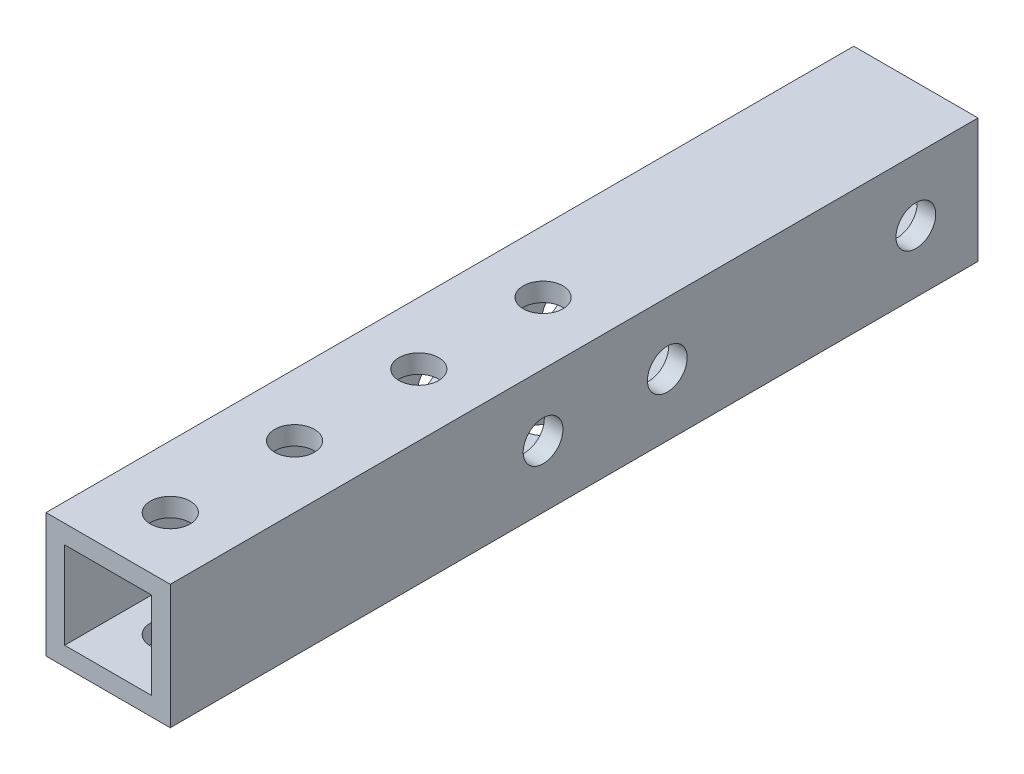
ISO-10303-21;
HEADER;
FILE_DESCRIPTION(('STEP AP214'),'2;1');
FILE_NAME('part.step','',(''),(''),'','','');
FILE_SCHEMA(('AUTOMOTIVE_DESIGN { 1 0 10303 214 1 1 1 1 }'));
ENDSEC;
DATA;
#1=APPLICATION_CONTEXT('core data for automotive mechanical design processes');
#2=APPLICATION_PROTOCOL_DEFINITION('international standard','automotive_design',2000,#1);
#3=PRODUCT_CONTEXT('',#1,'mechanical');
#4=PRODUCT('Part','Part','',(#3));
#5=PRODUCT_RELATED_PRODUCT_CATEGORY('part','',(#4));
#6=PRODUCT_DEFINITION_FORMATION('','',#4);
#7=PRODUCT_DEFINITION_CONTEXT('part definition',#1,'design');
#8=PRODUCT_DEFINITION('design','',#6,#7);
#9=PRODUCT_DEFINITION_SHAPE('','',#8);
#10=(LENGTH_UNIT() NAMED_UNIT(*) SI_UNIT(.MILLI.,.METRE.));
#11=(NAMED_UNIT(*) PLANE_ANGLE_UNIT() SI_UNIT($,.RADIAN.));
#12=(NAMED_UNIT(*) SI_UNIT($,.STERADIAN.) SOLID_ANGLE_UNIT());
#13=UNCERTAINTY_MEASURE_WITH_UNIT(LENGTH_MEASURE(1.E-05),#10,'distance_accuracy_value','');
#14=(GEOMETRIC_REPRESENTATION_CONTEXT(3) GLOBAL_UNCERTAINTY_ASSIGNED_CONTEXT((#13)) GLOBAL_UNIT_ASSIGNED_CONTEXT((#10,
#11,#12)) REPRESENTATION_CONTEXT('',''));
#15=CARTESIAN_POINT('',(0.,0.,0.));
#16=DIRECTION('',(0.,0.,1.));
#17=DIRECTION('',(1.,0.,0.));
#18=AXIS2_PLACEMENT_3D('',#15,#16,#17);
#19=CARTESIAN_POINT('',(0.,0.,65.));
#20=DIRECTION('',(0.,0.,1.));
#21=DIRECTION('',(1.,0.,0.));
#22=AXIS2_PLACEMENT_3D('',#19,#20,#21);
#23=PLANE('',#22);
#24=DIRECTION('',(0.,1.,0.));
#25=VECTOR('',#24,1.);
#26=CARTESIAN_POINT('',(5.,-5.,65.));
#27=LINE('',#26,#25);
#28=CARTESIAN_POINT('',(5.,-5.,65.));
#29=VERTEX_POINT('',#28);
#30=CARTESIAN_POINT('',(5.,5.,65.));
#31=VERTEX_POINT('',#30);
#32=EDGE_CURVE('E164',#29,#31,#27,.T.);
#33=ORIENTED_EDGE('',*,*,#32,.T.);
#34=DIRECTION('',(-1.,0.,0.));
#35=VECTOR('',#34,1.);
#36=CARTESIAN_POINT('',(-5.,5.,65.));
#37=LINE('',#36,#35);
#38=CARTESIAN_POINT('',(-5.,5.,65.));
#39=VERTEX_POINT('',#38);
#40=EDGE_CURVE('E167',#31,#39,#37,.T.);
#41=ORIENTED_EDGE('',*,*,#40,.T.);
#42=DIRECTION('',(0.,-1.,0.));
#43=VECTOR('',#42,1.);
#44=CARTESIAN_POINT('',(-5.,-5.,65.));
#45=LINE('',#44,#43);
#46=CARTESIAN_POINT('',(-5.,-5.,65.));
#47=VERTEX_POINT('',#46);
#48=EDGE_CURVE('E170',#39,#47,#45,.T.);
#49=ORIENTED_EDGE('',*,*,#48,.T.);
#50=DIRECTION('',(1.,0.,0.));
#51=VECTOR('',#50,1.);
#52=CARTESIAN_POINT('',(-5.,-5.,65.));
#53=LINE('',#52,#51);
#54=EDGE_CURVE('E172',#47,#29,#53,.T.);
#55=ORIENTED_EDGE('',*,*,#54,.T.);
#56=EDGE_LOOP('',(#33,#41,#49,#55));
#57=FACE_BOUND('',#56,.T.);
#58=DIRECTION('',(-1.,0.,0.));
#59=VECTOR('',#58,1.);
#60=CARTESIAN_POINT('',(0.,3.5,65.));
#61=LINE('',#60,#59);
#62=CARTESIAN_POINT('',(3.5,3.5,65.));
#63=VERTEX_POINT('',#62);
#64=CARTESIAN_POINT('',(-3.5,3.5,65.));
#65=VERTEX_POINT('',#64);
#66=EDGE_CURVE('E134',#63,#65,#61,.T.);
#67=ORIENTED_EDGE('',*,*,#66,.F.);
#68=DIRECTION('',(0.,1.,0.));
#69=VECTOR('',#68,1.);
#70=CARTESIAN_POINT('',(3.5,0.,65.));
#71=LINE('',#70,#69);
#72=CARTESIAN_POINT('',(3.5,-3.5,65.));
#73=VERTEX_POINT('',#72);
#74=EDGE_CURVE('E126',#73,#63,#71,.T.);
#75=ORIENTED_EDGE('',*,*,#74,.F.);
#76=DIRECTION('',(1.,0.,0.));
#77=VECTOR('',#76,1.);
#78=CARTESIAN_POINT('',(0.,-3.5,65.));
#79=LINE('',#78,#77);
#80=CARTESIAN_POINT('',(-3.5,-3.5,65.));
#81=VERTEX_POINT('',#80);
#82=EDGE_CURVE('E148',#81,#73,#79,.T.);
#83=ORIENTED_EDGE('',*,*,#82,.F.);
#84=DIRECTION('',(0.,-1.,0.));
#85=VECTOR('',#84,1.);
#86=CARTESIAN_POINT('',(-3.5,0.,65.));
#87=LINE('',#86,#85);
#88=EDGE_CURVE('E146',#65,#81,#87,.T.);
#89=ORIENTED_EDGE('',*,*,#88,.F.);
#90=EDGE_LOOP('',(#67,#75,#83,#89));
#91=FACE_BOUND('',#90,.T.);
#92=ADVANCED_FACE('F59',(#57,#91),#23,.T.);
#93=CARTESIAN_POINT('',(0.,0.,0.));
#94=DIRECTION('',(0.,0.,1.));
#95=DIRECTION('',(1.,0.,0.));
#96=AXIS2_PLACEMENT_3D('',#93,#94,#95);
#97=PLANE('',#96);
#98=DIRECTION('',(0.,1.,0.));
#99=VECTOR('',#98,1.);
#100=CARTESIAN_POINT('',(5.,-5.,0.));
#101=LINE('',#100,#99);
#102=CARTESIAN_POINT('',(5.,-5.,0.));
#103=VERTEX_POINT('',#102);
#104=CARTESIAN_POINT('',(5.,5.,0.));
#105=VERTEX_POINT('',#104);
#106=EDGE_CURVE('E142',#103,#105,#101,.T.);
#107=ORIENTED_EDGE('',*,*,#106,.F.);
#108=DIRECTION('',(1.,0.,0.));
#109=VECTOR('',#108,1.);
#110=CARTESIAN_POINT('',(-5.,-5.,0.));
#111=LINE('',#110,#109);
#112=CARTESIAN_POINT('',(-5.,-5.,0.));
#113=VERTEX_POINT('',#112);
#114=EDGE_CURVE('E168',#113,#103,#111,.T.);
#115=ORIENTED_EDGE('',*,*,#114,.F.);
#116=DIRECTION('',(0.,-1.,0.));
#117=VECTOR('',#116,1.);
#118=CARTESIAN_POINT('',(-5.,-5.,0.));
#119=LINE('',#118,#117);
#120=CARTESIAN_POINT('',(-5.,5.,0.));
#121=VERTEX_POINT('',#120);
#122=EDGE_CURVE('E179',#121,#113,#119,.T.);
#123=ORIENTED_EDGE('',*,*,#122,.F.);
#124=DIRECTION('',(-1.,0.,0.));
#125=VECTOR('',#124,1.);
#126=CARTESIAN_POINT('',(-5.,5.,0.));
#127=LINE('',#126,#125);
#128=EDGE_CURVE('E177',#105,#121,#127,.T.);
#129=ORIENTED_EDGE('',*,*,#128,.F.);
#130=EDGE_LOOP('',(#107,#115,#123,#129));
#131=FACE_BOUND('',#130,.T.);
#132=DIRECTION('',(0.,1.,0.));
#133=VECTOR('',#132,1.);
#134=CARTESIAN_POINT('',(3.5,0.,0.));
#135=LINE('',#134,#133);
#136=CARTESIAN_POINT('',(3.5,-3.5,0.));
#137=VERTEX_POINT('',#136);
#138=CARTESIAN_POINT('',(3.5,3.5,0.));
#139=VERTEX_POINT('',#138);
#140=EDGE_CURVE('E84',#137,#139,#135,.T.);
#141=ORIENTED_EDGE('',*,*,#140,.T.);
#142=DIRECTION('',(-1.,0.,0.));
#143=VECTOR('',#142,1.);
#144=CARTESIAN_POINT('',(0.,3.5,0.));
#145=LINE('',#144,#143);
#146=CARTESIAN_POINT('',(-3.5,3.5,0.));
#147=VERTEX_POINT('',#146);
#148=EDGE_CURVE('E141',#139,#147,#145,.T.);
#149=ORIENTED_EDGE('',*,*,#148,.T.);
#150=DIRECTION('',(0.,-1.,0.));
#151=VECTOR('',#150,1.);
#152=CARTESIAN_POINT('',(-3.5,0.,0.));
#153=LINE('',#152,#151);
#154=CARTESIAN_POINT('',(-3.5,-3.5,0.));
#155=VERTEX_POINT('',#154);
#156=EDGE_CURVE('E156',#147,#155,#153,.T.);
#157=ORIENTED_EDGE('',*,*,#156,.T.);
#158=DIRECTION('',(1.,0.,0.));
#159=VECTOR('',#158,1.);
#160=CARTESIAN_POINT('',(0.,-3.5,0.));
#161=LINE('',#160,#159);
#162=EDGE_CURVE('E135',#155,#137,#161,.T.);
#163=ORIENTED_EDGE('',*,*,#162,.T.);
#164=EDGE_LOOP('',(#141,#149,#157,#163));
#165=FACE_BOUND('',#164,.T.);
#166=ADVANCED_FACE('F259',(#131,#165),#97,.F.);
#167=CARTESIAN_POINT('',(5.,-5.,65.));
#168=DIRECTION('',(-1.,0.,0.));
#169=DIRECTION('',(0.,0.,1.));
#170=AXIS2_PLACEMENT_3D('',#167,#168,#169);
#171=PLANE('',#170);
#172=CARTESIAN_POINT('',(5.,0.,35.));
#173=DIRECTION('',(1.,0.,0.));
#174=DIRECTION('',(0.,0.,-1.));
#175=AXIS2_PLACEMENT_3D('',#172,#173,#174);
#176=CIRCLE('',#175,1.60000000000001);
#177=CARTESIAN_POINT('',(5.,0.,33.4));
#178=VERTEX_POINT('',#177);
#179=EDGE_CURVE('E347',#178,#178,#176,.T.);
#180=ORIENTED_EDGE('',*,*,#179,.F.);
#181=EDGE_LOOP('',(#180));
#182=FACE_BOUND('',#181,.T.);
#183=CARTESIAN_POINT('',(5.,0.,5.));
#184=DIRECTION('',(-1.,0.,0.));
#185=DIRECTION('',(0.,0.,1.));
#186=AXIS2_PLACEMENT_3D('',#183,#184,#185);
#187=CIRCLE('',#186,1.6);
#188=CARTESIAN_POINT('',(5.,0.,6.6));
#189=VERTEX_POINT('',#188);
#190=EDGE_CURVE('E193',#189,#189,#187,.T.);
#191=ORIENTED_EDGE('',*,*,#190,.T.);
#192=EDGE_LOOP('',(#191));
#193=FACE_BOUND('',#192,.T.);
#194=CARTESIAN_POINT('',(5.,0.,25.));
#195=DIRECTION('',(-1.,0.,0.));
#196=DIRECTION('',(0.,0.,1.));
#197=AXIS2_PLACEMENT_3D('',#194,#195,#196);
#198=CIRCLE('',#197,1.6);
#199=CARTESIAN_POINT('',(5.,0.,26.6));
#200=VERTEX_POINT('',#199);
#201=EDGE_CURVE('E229',#200,#200,#198,.T.);
#202=ORIENTED_EDGE('',*,*,#201,.T.);
#203=EDGE_LOOP('',(#202));
#204=FACE_BOUND('',#203,.T.);
#205=ORIENTED_EDGE('',*,*,#106,.T.);
#206=DIRECTION('',(0.,0.,-1.));
#207=VECTOR('',#206,1.);
#208=CARTESIAN_POINT('',(5.,5.,65.));
#209=LINE('',#208,#207);
#210=EDGE_CURVE('E12',#31,#105,#209,.T.);
#211=ORIENTED_EDGE('',*,*,#210,.F.);
#212=ORIENTED_EDGE('',*,*,#32,.F.);
#213=DIRECTION('',(0.,0.,-1.));
#214=VECTOR('',#213,1.);
#215=CARTESIAN_POINT('',(5.,-5.,65.));
#216=LINE('',#215,#214);
#217=EDGE_CURVE('E174',#29,#103,#216,.T.);
#218=ORIENTED_EDGE('',*,*,#217,.T.);
#219=EDGE_LOOP('',(#205,#211,#212,#218));
#220=FACE_BOUND('',#219,.T.);
#221=ADVANCED_FACE('F61',(#182,#193,#204,#220),#171,.F.);
#222=CARTESIAN_POINT('',(-5.,5.,65.));
#223=DIRECTION('',(0.,-1.,0.));
#224=DIRECTION('',(0.,0.,-1.));
#225=AXIS2_PLACEMENT_3D('',#222,#223,#224);
#226=PLANE('',#225);
#227=CARTESIAN_POINT('',(3.08926903345207E-13,5.,30.));
#228=DIRECTION('',(0.,-1.,0.));
#229=DIRECTION('',(0.,0.,-1.));
#230=AXIS2_PLACEMENT_3D('',#227,#228,#229);
#231=CIRCLE('',#230,1.59999999999999);
#232=CARTESIAN_POINT('',(3.08926903345207E-13,5.,28.4));
#233=VERTEX_POINT('',#232);
#234=EDGE_CURVE('E201',#233,#233,#231,.T.);
#235=ORIENTED_EDGE('',*,*,#234,.T.);
#236=EDGE_LOOP('',(#235));
#237=FACE_BOUND('',#236,.T.);
#238=CARTESIAN_POINT('',(2.04794786579487E-13,5.,40.));
#239=DIRECTION('',(0.,-1.,0.));
#240=DIRECTION('',(0.,0.,-1.));
#241=AXIS2_PLACEMENT_3D('',#238,#239,#240);
#242=CIRCLE('',#241,1.6);
#243=CARTESIAN_POINT('',(2.04794786579487E-13,5.,38.4));
#244=VERTEX_POINT('',#243);
#245=EDGE_CURVE('E361',#244,#244,#242,.T.);
#246=ORIENTED_EDGE('',*,*,#245,.T.);
#247=EDGE_LOOP('',(#246));
#248=FACE_BOUND('',#247,.T.);
#249=CARTESIAN_POINT('',(1.00662669813767E-13,5.,50.));
#250=DIRECTION('',(0.,-1.,0.));
#251=DIRECTION('',(0.,0.,-1.));
#252=AXIS2_PLACEMENT_3D('',#249,#250,#251);
#253=CIRCLE('',#252,1.6);
#254=CARTESIAN_POINT('',(1.00662669813767E-13,5.,48.4));
#255=VERTEX_POINT('',#254);
#256=EDGE_CURVE('E367',#255,#255,#253,.T.);
#257=ORIENTED_EDGE('',*,*,#256,.T.);
#258=EDGE_LOOP('',(#257));
#259=FACE_BOUND('',#258,.T.);
#260=CARTESIAN_POINT('',(0.,5.,60.));
#261=DIRECTION('',(0.,-1.,0.));
#262=DIRECTION('',(0.,0.,-1.));
#263=AXIS2_PLACEMENT_3D('',#260,#261,#262);
#264=CIRCLE('',#263,1.59999999999655);
#265=CARTESIAN_POINT('',(0.,5.,58.4000000000035));
#266=VERTEX_POINT('',#265);
#267=EDGE_CURVE('E373',#266,#266,#264,.T.);
#268=ORIENTED_EDGE('',*,*,#267,.T.);
#269=EDGE_LOOP('',(#268));
#270=FACE_BOUND('',#269,.T.);
#271=ORIENTED_EDGE('',*,*,#128,.T.);
#272=DIRECTION('',(0.,0.,-1.));
#273=VECTOR('',#272,1.);
#274=CARTESIAN_POINT('',(-5.,5.,65.));
#275=LINE('',#274,#273);
#276=EDGE_CURVE('E68',#39,#121,#275,.T.);
#277=ORIENTED_EDGE('',*,*,#276,.F.);
#278=ORIENTED_EDGE('',*,*,#40,.F.);
#279=ORIENTED_EDGE('',*,*,#210,.T.);
#280=EDGE_LOOP('',(#271,#277,#278,#279));
#281=FACE_BOUND('',#280,.T.);
#282=ADVANCED_FACE('F258',(#237,#248,#259,#270,#281),#226,.F.);
#283=CARTESIAN_POINT('',(-5.,-5.,65.));
#284=DIRECTION('',(1.,0.,0.));
#285=DIRECTION('',(0.,0.,-1.));
#286=AXIS2_PLACEMENT_3D('',#283,#284,#285);
#287=PLANE('',#286);
#288=CARTESIAN_POINT('',(-5.,0.,35.));
#289=DIRECTION('',(1.,0.,0.));
#290=DIRECTION('',(0.,0.,-1.));
#291=AXIS2_PLACEMENT_3D('',#288,#289,#290);
#292=CIRCLE('',#291,1.60000000000001);
#293=CARTESIAN_POINT('',(-5.,0.,33.4));
#294=VERTEX_POINT('',#293);
#295=EDGE_CURVE('E346',#294,#294,#292,.T.);
#296=ORIENTED_EDGE('',*,*,#295,.T.);
#297=EDGE_LOOP('',(#296));
#298=FACE_BOUND('',#297,.T.);
#299=CARTESIAN_POINT('',(-5.,0.,5.));
#300=DIRECTION('',(-1.,0.,0.));
#301=DIRECTION('',(0.,0.,1.));
#302=AXIS2_PLACEMENT_3D('',#299,#300,#301);
#303=CIRCLE('',#302,1.6);
#304=CARTESIAN_POINT('',(-5.,0.,6.6));
#305=VERTEX_POINT('',#304);
#306=EDGE_CURVE('E226',#305,#305,#303,.T.);
#307=ORIENTED_EDGE('',*,*,#306,.F.);
#308=EDGE_LOOP('',(#307));
#309=FACE_BOUND('',#308,.T.);
#310=CARTESIAN_POINT('',(-5.,0.,25.));
#311=DIRECTION('',(-1.,0.,0.));
#312=DIRECTION('',(0.,0.,1.));
#313=AXIS2_PLACEMENT_3D('',#310,#311,#312);
#314=CIRCLE('',#313,1.6);
#315=CARTESIAN_POINT('',(-5.,0.,26.6));
#316=VERTEX_POINT('',#315);
#317=EDGE_CURVE('E215',#316,#316,#314,.T.);
#318=ORIENTED_EDGE('',*,*,#317,.F.);
#319=EDGE_LOOP('',(#318));
#320=FACE_BOUND('',#319,.T.);
#321=ORIENTED_EDGE('',*,*,#122,.T.);
#322=DIRECTION('',(0.,0.,-1.));
#323=VECTOR('',#322,1.);
#324=CARTESIAN_POINT('',(-5.,-5.,65.));
#325=LINE('',#324,#323);
#326=EDGE_CURVE('E184',#47,#113,#325,.T.);
#327=ORIENTED_EDGE('',*,*,#326,.F.);
#328=ORIENTED_EDGE('',*,*,#48,.F.);
#329=ORIENTED_EDGE('',*,*,#276,.T.);
#330=EDGE_LOOP('',(#321,#327,#328,#329));
#331=FACE_BOUND('',#330,.T.);
#332=ADVANCED_FACE('F277',(#298,#309,#320,#331),#287,.F.);
#333=CARTESIAN_POINT('',(-5.,-5.,65.));
#334=DIRECTION('',(0.,1.,0.));
#335=DIRECTION('',(0.,0.,1.));
#336=AXIS2_PLACEMENT_3D('',#333,#334,#335);
#337=PLANE('',#336);
#338=CARTESIAN_POINT('',(3.08926903345207E-13,-5.,30.));
#339=DIRECTION('',(0.,-1.,0.));
#340=DIRECTION('',(0.,0.,-1.));
#341=AXIS2_PLACEMENT_3D('',#338,#339,#340);
#342=CIRCLE('',#341,1.59999999999999);
#343=CARTESIAN_POINT('',(3.08926903345207E-13,-5.,28.4));
#344=VERTEX_POINT('',#343);
#345=EDGE_CURVE('E358',#344,#344,#342,.T.);
#346=ORIENTED_EDGE('',*,*,#345,.F.);
#347=EDGE_LOOP('',(#346));
#348=FACE_BOUND('',#347,.T.);
#349=CARTESIAN_POINT('',(2.04794786579487E-13,-5.,40.));
#350=DIRECTION('',(0.,-1.,0.));
#351=DIRECTION('',(0.,0.,-1.));
#352=AXIS2_PLACEMENT_3D('',#349,#350,#351);
#353=CIRCLE('',#352,1.6);
#354=CARTESIAN_POINT('',(2.04794786579487E-13,-5.,38.4));
#355=VERTEX_POINT('',#354);
#356=EDGE_CURVE('E364',#355,#355,#353,.T.);
#357=ORIENTED_EDGE('',*,*,#356,.F.);
#358=EDGE_LOOP('',(#357));
#359=FACE_BOUND('',#358,.T.);
#360=CARTESIAN_POINT('',(1.00662669813767E-13,-5.,50.));
#361=DIRECTION('',(0.,-1.,0.));
#362=DIRECTION('',(0.,0.,-1.));
#363=AXIS2_PLACEMENT_3D('',#360,#361,#362);
#364=CIRCLE('',#363,1.6);
#365=CARTESIAN_POINT('',(1.00662669813767E-13,-5.,48.4));
#366=VERTEX_POINT('',#365);
#367=EDGE_CURVE('E370',#366,#366,#364,.T.);
#368=ORIENTED_EDGE('',*,*,#367,.F.);
#369=EDGE_LOOP('',(#368));
#370=FACE_BOUND('',#369,.T.);
#371=CARTESIAN_POINT('',(0.,-5.,60.));
#372=DIRECTION('',(0.,-1.,0.));
#373=DIRECTION('',(0.,0.,-1.));
#374=AXIS2_PLACEMENT_3D('',#371,#372,#373);
#375=CIRCLE('',#374,1.59999999999655);
#376=CARTESIAN_POINT('',(0.,-5.,58.4000000000035));
#377=VERTEX_POINT('',#376);
#378=EDGE_CURVE('E355',#377,#377,#375,.T.);
#379=ORIENTED_EDGE('',*,*,#378,.F.);
#380=EDGE_LOOP('',(#379));
#381=FACE_BOUND('',#380,.T.);
#382=ORIENTED_EDGE('',*,*,#114,.T.);
#383=ORIENTED_EDGE('',*,*,#217,.F.);
#384=ORIENTED_EDGE('',*,*,#54,.F.);
#385=ORIENTED_EDGE('',*,*,#326,.T.);
#386=EDGE_LOOP('',(#382,#383,#384,#385));
#387=FACE_BOUND('',#386,.T.);
#388=ADVANCED_FACE('F243',(#348,#359,#370,#381,#387),#337,.F.);
#389=CARTESIAN_POINT('',(3.5,0.,65.));
#390=DIRECTION('',(-1.,0.,0.));
#391=DIRECTION('',(0.,0.,1.));
#392=AXIS2_PLACEMENT_3D('',#389,#390,#391);
#393=PLANE('',#392);
#394=CARTESIAN_POINT('',(3.5,0.,35.));
#395=DIRECTION('',(-1.,0.,0.));
#396=DIRECTION('',(0.,0.,1.));
#397=AXIS2_PLACEMENT_3D('',#394,#395,#396);
#398=CIRCLE('',#397,1.60000000000001);
#399=CARTESIAN_POINT('',(3.5,0.,36.6));
#400=VERTEX_POINT('',#399);
#401=EDGE_CURVE('E349',#400,#400,#398,.T.);
#402=ORIENTED_EDGE('',*,*,#401,.F.);
#403=EDGE_LOOP('',(#402));
#404=FACE_BOUND('',#403,.T.);
#405=CARTESIAN_POINT('',(3.5,0.,5.));
#406=DIRECTION('',(-1.,0.,0.));
#407=DIRECTION('',(0.,0.,1.));
#408=AXIS2_PLACEMENT_3D('',#405,#406,#407);
#409=CIRCLE('',#408,1.6);
#410=CARTESIAN_POINT('',(3.5,0.,6.6));
#411=VERTEX_POINT('',#410);
#412=EDGE_CURVE('E154',#411,#411,#409,.T.);
#413=ORIENTED_EDGE('',*,*,#412,.F.);
#414=EDGE_LOOP('',(#413));
#415=FACE_BOUND('',#414,.T.);
#416=CARTESIAN_POINT('',(3.5,0.,25.));
#417=DIRECTION('',(-1.,0.,0.));
#418=DIRECTION('',(0.,0.,1.));
#419=AXIS2_PLACEMENT_3D('',#416,#417,#418);
#420=CIRCLE('',#419,1.6);
#421=CARTESIAN_POINT('',(3.5,0.,26.6));
#422=VERTEX_POINT('',#421);
#423=EDGE_CURVE('E192',#422,#422,#420,.T.);
#424=ORIENTED_EDGE('',*,*,#423,.F.);
#425=EDGE_LOOP('',(#424));
#426=FACE_BOUND('',#425,.T.);
#427=ORIENTED_EDGE('',*,*,#140,.F.);
#428=DIRECTION('',(0.,0.,-1.));
#429=VECTOR('',#428,1.);
#430=CARTESIAN_POINT('',(3.5,-3.5,65.));
#431=LINE('',#430,#429);
#432=EDGE_CURVE('E130',#73,#137,#431,.T.);
#433=ORIENTED_EDGE('',*,*,#432,.F.);
#434=ORIENTED_EDGE('',*,*,#74,.T.);
#435=DIRECTION('',(0.,0.,-1.));
#436=VECTOR('',#435,1.);
#437=CARTESIAN_POINT('',(3.5,3.5,65.));
#438=LINE('',#437,#436);
#439=EDGE_CURVE('E129',#63,#139,#438,.T.);
#440=ORIENTED_EDGE('',*,*,#439,.T.);
#441=EDGE_LOOP('',(#427,#433,#434,#440));
#442=FACE_BOUND('',#441,.T.);
#443=ADVANCED_FACE('F128',(#404,#415,#426,#442),#393,.T.);
#444=CARTESIAN_POINT('',(0.,3.5,65.));
#445=DIRECTION('',(0.,-1.,0.));
#446=DIRECTION('',(0.,0.,-1.));
#447=AXIS2_PLACEMENT_3D('',#444,#445,#446);
#448=PLANE('',#447);
#449=CARTESIAN_POINT('',(3.08926903345207E-13,3.5,30.));
#450=DIRECTION('',(0.,-1.,0.));
#451=DIRECTION('',(0.,0.,-1.));
#452=AXIS2_PLACEMENT_3D('',#449,#450,#451);
#453=CIRCLE('',#452,1.59999999999999);
#454=CARTESIAN_POINT('',(3.08926903345207E-13,3.5,28.4));
#455=VERTEX_POINT('',#454);
#456=EDGE_CURVE('E211',#455,#455,#453,.T.);
#457=ORIENTED_EDGE('',*,*,#456,.F.);
#458=EDGE_LOOP('',(#457));
#459=FACE_BOUND('',#458,.T.);
#460=CARTESIAN_POINT('',(2.04794786579487E-13,3.5,40.));
#461=DIRECTION('',(0.,-1.,0.));
#462=DIRECTION('',(0.,0.,-1.));
#463=AXIS2_PLACEMENT_3D('',#460,#461,#462);
#464=CIRCLE('',#463,1.6);
#465=CARTESIAN_POINT('',(2.04794786579487E-13,3.5,38.4));
#466=VERTEX_POINT('',#465);
#467=EDGE_CURVE('E208',#466,#466,#464,.T.);
#468=ORIENTED_EDGE('',*,*,#467,.F.);
#469=EDGE_LOOP('',(#468));
#470=FACE_BOUND('',#469,.T.);
#471=CARTESIAN_POINT('',(1.00662669813767E-13,3.5,50.));
#472=DIRECTION('',(0.,-1.,0.));
#473=DIRECTION('',(0.,0.,-1.));
#474=AXIS2_PLACEMENT_3D('',#471,#472,#473);
#475=CIRCLE('',#474,1.6);
#476=CARTESIAN_POINT('',(1.00662669813767E-13,3.5,48.4));
#477=VERTEX_POINT('',#476);
#478=EDGE_CURVE('E205',#477,#477,#475,.T.);
#479=ORIENTED_EDGE('',*,*,#478,.F.);
#480=EDGE_LOOP('',(#479));
#481=FACE_BOUND('',#480,.T.);
#482=CARTESIAN_POINT('',(0.,3.5,60.));
#483=DIRECTION('',(0.,-1.,0.));
#484=DIRECTION('',(0.,0.,-1.));
#485=AXIS2_PLACEMENT_3D('',#482,#483,#484);
#486=CIRCLE('',#485,1.59999999999655);
#487=CARTESIAN_POINT('',(0.,3.5,58.4000000000035));
#488=VERTEX_POINT('',#487);
#489=EDGE_CURVE('E200',#488,#488,#486,.T.);
#490=ORIENTED_EDGE('',*,*,#489,.F.);
#491=EDGE_LOOP('',(#490));
#492=FACE_BOUND('',#491,.T.);
#493=ORIENTED_EDGE('',*,*,#148,.F.);
#494=ORIENTED_EDGE('',*,*,#439,.F.);
#495=ORIENTED_EDGE('',*,*,#66,.T.);
#496=DIRECTION('',(0.,0.,-1.));
#497=VECTOR('',#496,1.);
#498=CARTESIAN_POINT('',(-3.5,3.5,65.));
#499=LINE('',#498,#497);
#500=EDGE_CURVE('E143',#65,#147,#499,.T.);
#501=ORIENTED_EDGE('',*,*,#500,.T.);
#502=EDGE_LOOP('',(#493,#494,#495,#501));
#503=FACE_BOUND('',#502,.T.);
#504=ADVANCED_FACE('F138',(#459,#470,#481,#492,#503),#448,.T.);
#505=CARTESIAN_POINT('',(-3.5,0.,65.));
#506=DIRECTION('',(1.,0.,0.));
#507=DIRECTION('',(0.,0.,-1.));
#508=AXIS2_PLACEMENT_3D('',#505,#506,#507);
#509=PLANE('',#508);
#510=CARTESIAN_POINT('',(-3.5,0.,35.));
#511=DIRECTION('',(1.,0.,0.));
#512=DIRECTION('',(0.,0.,-1.));
#513=AXIS2_PLACEMENT_3D('',#510,#511,#512);
#514=CIRCLE('',#513,1.60000000000001);
#515=CARTESIAN_POINT('',(-3.5,0.,33.4));
#516=VERTEX_POINT('',#515);
#517=EDGE_CURVE('E63',#516,#516,#514,.T.);
#518=ORIENTED_EDGE('',*,*,#517,.F.);
#519=EDGE_LOOP('',(#518));
#520=FACE_BOUND('',#519,.T.);
#521=CARTESIAN_POINT('',(-3.5,0.,5.));
#522=DIRECTION('',(1.,0.,0.));
#523=DIRECTION('',(0.,0.,-1.));
#524=AXIS2_PLACEMENT_3D('',#521,#522,#523);
#525=CIRCLE('',#524,1.6);
#526=CARTESIAN_POINT('',(-3.5,0.,3.4));
#527=VERTEX_POINT('',#526);
#528=EDGE_CURVE('E194',#527,#527,#525,.T.);
#529=ORIENTED_EDGE('',*,*,#528,.F.);
#530=EDGE_LOOP('',(#529));
#531=FACE_BOUND('',#530,.T.);
#532=CARTESIAN_POINT('',(-3.5,0.,25.));
#533=DIRECTION('',(1.,0.,0.));
#534=DIRECTION('',(0.,0.,-1.));
#535=AXIS2_PLACEMENT_3D('',#532,#533,#534);
#536=CIRCLE('',#535,1.6);
#537=CARTESIAN_POINT('',(-3.5,0.,23.4));
#538=VERTEX_POINT('',#537);
#539=EDGE_CURVE('E189',#538,#538,#536,.T.);
#540=ORIENTED_EDGE('',*,*,#539,.F.);
#541=EDGE_LOOP('',(#540));
#542=FACE_BOUND('',#541,.T.);
#543=ORIENTED_EDGE('',*,*,#156,.F.);
#544=ORIENTED_EDGE('',*,*,#500,.F.);
#545=ORIENTED_EDGE('',*,*,#88,.T.);
#546=DIRECTION('',(0.,0.,-1.));
#547=VECTOR('',#546,1.);
#548=CARTESIAN_POINT('',(-3.5,-3.5,65.));
#549=LINE('',#548,#547);
#550=EDGE_CURVE('E76',#81,#155,#549,.T.);
#551=ORIENTED_EDGE('',*,*,#550,.T.);
#552=EDGE_LOOP('',(#543,#544,#545,#551));
#553=FACE_BOUND('',#552,.T.);
#554=ADVANCED_FACE('F299',(#520,#531,#542,#553),#509,.T.);
#555=CARTESIAN_POINT('',(0.,-3.5,65.));
#556=DIRECTION('',(0.,1.,0.));
#557=DIRECTION('',(0.,0.,1.));
#558=AXIS2_PLACEMENT_3D('',#555,#556,#557);
#559=PLANE('',#558);
#560=CARTESIAN_POINT('',(3.08926903345207E-13,-3.5,30.));
#561=DIRECTION('',(0.,1.,0.));
#562=DIRECTION('',(0.,0.,1.));
#563=AXIS2_PLACEMENT_3D('',#560,#561,#562);
#564=CIRCLE('',#563,1.59999999999999);
#565=CARTESIAN_POINT('',(3.08926903345207E-13,-3.5,31.6));
#566=VERTEX_POINT('',#565);
#567=EDGE_CURVE('E209',#566,#566,#564,.T.);
#568=ORIENTED_EDGE('',*,*,#567,.F.);
#569=EDGE_LOOP('',(#568));
#570=FACE_BOUND('',#569,.T.);
#571=CARTESIAN_POINT('',(2.04794786579487E-13,-3.5,40.));
#572=DIRECTION('',(0.,1.,0.));
#573=DIRECTION('',(0.,0.,1.));
#574=AXIS2_PLACEMENT_3D('',#571,#572,#573);
#575=CIRCLE('',#574,1.6);
#576=CARTESIAN_POINT('',(2.04794786579487E-13,-3.5,41.6));
#577=VERTEX_POINT('',#576);
#578=EDGE_CURVE('E206',#577,#577,#575,.T.);
#579=ORIENTED_EDGE('',*,*,#578,.F.);
#580=EDGE_LOOP('',(#579));
#581=FACE_BOUND('',#580,.T.);
#582=CARTESIAN_POINT('',(1.00662669813767E-13,-3.5,50.));
#583=DIRECTION('',(0.,1.,0.));
#584=DIRECTION('',(0.,0.,1.));
#585=AXIS2_PLACEMENT_3D('',#582,#583,#584);
#586=CIRCLE('',#585,1.6);
#587=CARTESIAN_POINT('',(1.00662669813767E-13,-3.5,51.6));
#588=VERTEX_POINT('',#587);
#589=EDGE_CURVE('E202',#588,#588,#586,.T.);
#590=ORIENTED_EDGE('',*,*,#589,.F.);
#591=EDGE_LOOP('',(#590));
#592=FACE_BOUND('',#591,.T.);
#593=CARTESIAN_POINT('',(0.,-3.5,60.));
#594=DIRECTION('',(0.,1.,0.));
#595=DIRECTION('',(0.,0.,1.));
#596=AXIS2_PLACEMENT_3D('',#593,#594,#595);
#597=CIRCLE('',#596,1.59999999999655);
#598=CARTESIAN_POINT('',(0.,-3.5,61.5999999999965));
#599=VERTEX_POINT('',#598);
#600=EDGE_CURVE('E197',#599,#599,#597,.T.);
#601=ORIENTED_EDGE('',*,*,#600,.F.);
#602=EDGE_LOOP('',(#601));
#603=FACE_BOUND('',#602,.T.);
#604=ORIENTED_EDGE('',*,*,#162,.F.);
#605=ORIENTED_EDGE('',*,*,#550,.F.);
#606=ORIENTED_EDGE('',*,*,#82,.T.);
#607=ORIENTED_EDGE('',*,*,#432,.T.);
#608=EDGE_LOOP('',(#604,#605,#606,#607));
#609=FACE_BOUND('',#608,.T.);
#610=ADVANCED_FACE('F303',(#570,#581,#592,#603,#609),#559,.T.);
#611=CARTESIAN_POINT('',(5.,0.,25.));
#612=DIRECTION('',(-1.,0.,0.));
#613=DIRECTION('',(0.,0.,1.));
#614=AXIS2_PLACEMENT_3D('',#611,#612,#613);
#615=CYLINDRICAL_SURFACE('',#614,1.6);
#616=ORIENTED_EDGE('',*,*,#539,.T.);
#617=EDGE_LOOP('',(#616));
#618=FACE_BOUND('',#617,.T.);
#619=ORIENTED_EDGE('',*,*,#317,.T.);
#620=EDGE_LOOP('',(#619));
#621=FACE_BOUND('',#620,.T.);
#622=ADVANCED_FACE('F253',(#618,#621),#615,.F.);
#623=CARTESIAN_POINT('',(5.,0.,5.));
#624=DIRECTION('',(-1.,0.,0.));
#625=DIRECTION('',(0.,0.,1.));
#626=AXIS2_PLACEMENT_3D('',#623,#624,#625);
#627=CYLINDRICAL_SURFACE('',#626,1.6);
#628=ORIENTED_EDGE('',*,*,#528,.T.);
#629=EDGE_LOOP('',(#628));
#630=FACE_BOUND('',#629,.T.);
#631=ORIENTED_EDGE('',*,*,#306,.T.);
#632=EDGE_LOOP('',(#631));
#633=FACE_BOUND('',#632,.T.);
#634=ADVANCED_FACE('F251',(#630,#633),#627,.F.);
#635=ORIENTED_EDGE('',*,*,#423,.T.);
#636=EDGE_LOOP('',(#635));
#637=FACE_BOUND('',#636,.T.);
#638=ORIENTED_EDGE('',*,*,#201,.F.);
#639=EDGE_LOOP('',(#638));
#640=FACE_BOUND('',#639,.T.);
#641=ADVANCED_FACE('F248',(#637,#640),#615,.F.);
#642=ORIENTED_EDGE('',*,*,#412,.T.);
#643=EDGE_LOOP('',(#642));
#644=FACE_BOUND('',#643,.T.);
#645=ORIENTED_EDGE('',*,*,#190,.F.);
#646=EDGE_LOOP('',(#645));
#647=FACE_BOUND('',#646,.T.);
#648=ADVANCED_FACE('F238',(#644,#647),#627,.F.);
#649=CARTESIAN_POINT('',(0.,5.,60.));
#650=DIRECTION('',(0.,-1.,0.));
#651=DIRECTION('',(0.,0.,-1.));
#652=AXIS2_PLACEMENT_3D('',#649,#650,#651);
#653=CYLINDRICAL_SURFACE('',#652,1.59999999999655);
#654=ORIENTED_EDGE('',*,*,#600,.T.);
#655=EDGE_LOOP('',(#654));
#656=FACE_BOUND('',#655,.T.);
#657=ORIENTED_EDGE('',*,*,#378,.T.);
#658=EDGE_LOOP('',(#657));
#659=FACE_BOUND('',#658,.T.);
#660=ADVANCED_FACE('F313',(#656,#659),#653,.F.);
#661=CARTESIAN_POINT('',(1.00662669813767E-13,5.,50.));
#662=DIRECTION('',(0.,-1.,0.));
#663=DIRECTION('',(0.,0.,-1.));
#664=AXIS2_PLACEMENT_3D('',#661,#662,#663);
#665=CYLINDRICAL_SURFACE('',#664,1.6);
#666=ORIENTED_EDGE('',*,*,#589,.T.);
#667=EDGE_LOOP('',(#666));
#668=FACE_BOUND('',#667,.T.);
#669=ORIENTED_EDGE('',*,*,#367,.T.);
#670=EDGE_LOOP('',(#669));
#671=FACE_BOUND('',#670,.T.);
#672=ADVANCED_FACE('F316',(#668,#671),#665,.F.);
#673=CARTESIAN_POINT('',(2.04794786579487E-13,5.,40.));
#674=DIRECTION('',(0.,-1.,0.));
#675=DIRECTION('',(0.,0.,-1.));
#676=AXIS2_PLACEMENT_3D('',#673,#674,#675);
#677=CYLINDRICAL_SURFACE('',#676,1.6);
#678=ORIENTED_EDGE('',*,*,#578,.T.);
#679=EDGE_LOOP('',(#678));
#680=FACE_BOUND('',#679,.T.);
#681=ORIENTED_EDGE('',*,*,#356,.T.);
#682=EDGE_LOOP('',(#681));
#683=FACE_BOUND('',#682,.T.);
#684=ADVANCED_FACE('F321',(#680,#683),#677,.F.);
#685=CARTESIAN_POINT('',(3.08926903345207E-13,5.,30.));
#686=DIRECTION('',(0.,-1.,0.));
#687=DIRECTION('',(0.,0.,-1.));
#688=AXIS2_PLACEMENT_3D('',#685,#686,#687);
#689=CYLINDRICAL_SURFACE('',#688,1.59999999999999);
#690=ORIENTED_EDGE('',*,*,#567,.T.);
#691=EDGE_LOOP('',(#690));
#692=FACE_BOUND('',#691,.T.);
#693=ORIENTED_EDGE('',*,*,#345,.T.);
#694=EDGE_LOOP('',(#693));
#695=FACE_BOUND('',#694,.T.);
#696=ADVANCED_FACE('F326',(#692,#695),#689,.F.);
#697=ORIENTED_EDGE('',*,*,#489,.T.);
#698=EDGE_LOOP('',(#697));
#699=FACE_BOUND('',#698,.T.);
#700=ORIENTED_EDGE('',*,*,#267,.F.);
#701=EDGE_LOOP('',(#700));
#702=FACE_BOUND('',#701,.T.);
#703=ADVANCED_FACE('F318',(#699,#702),#653,.F.);
#704=ORIENTED_EDGE('',*,*,#478,.T.);
#705=EDGE_LOOP('',(#704));
#706=FACE_BOUND('',#705,.T.);
#707=ORIENTED_EDGE('',*,*,#256,.F.);
#708=EDGE_LOOP('',(#707));
#709=FACE_BOUND('',#708,.T.);
#710=ADVANCED_FACE('F323',(#706,#709),#665,.F.);
#711=ORIENTED_EDGE('',*,*,#467,.T.);
#712=EDGE_LOOP('',(#711));
#713=FACE_BOUND('',#712,.T.);
#714=ORIENTED_EDGE('',*,*,#245,.F.);
#715=EDGE_LOOP('',(#714));
#716=FACE_BOUND('',#715,.T.);
#717=ADVANCED_FACE('F328',(#713,#716),#677,.F.);
#718=ORIENTED_EDGE('',*,*,#456,.T.);
#719=EDGE_LOOP('',(#718));
#720=FACE_BOUND('',#719,.T.);
#721=ORIENTED_EDGE('',*,*,#234,.F.);
#722=EDGE_LOOP('',(#721));
#723=FACE_BOUND('',#722,.T.);
#724=ADVANCED_FACE('F331',(#720,#723),#689,.F.);
#725=CARTESIAN_POINT('',(-5.,0.,35.));
#726=DIRECTION('',(1.,0.,0.));
#727=DIRECTION('',(0.,0.,-1.));
#728=AXIS2_PLACEMENT_3D('',#725,#726,#727);
#729=CYLINDRICAL_SURFACE('',#728,1.60000000000001);
#730=ORIENTED_EDGE('',*,*,#517,.T.);
#731=EDGE_LOOP('',(#730));
#732=FACE_BOUND('',#731,.T.);
#733=ORIENTED_EDGE('',*,*,#295,.F.);
#734=EDGE_LOOP('',(#733));
#735=FACE_BOUND('',#734,.T.);
#736=ADVANCED_FACE('F332',(#732,#735),#729,.F.);
#737=ORIENTED_EDGE('',*,*,#401,.T.);
#738=EDGE_LOOP('',(#737));
#739=FACE_BOUND('',#738,.T.);
#740=ORIENTED_EDGE('',*,*,#179,.T.);
#741=EDGE_LOOP('',(#740));
#742=FACE_BOUND('',#741,.T.);
#743=ADVANCED_FACE('F334',(#739,#742),#729,.F.);
#744=CLOSED_SHELL('',(#92,#166,#221,#282,#332,#388,#443,#504,#554,#610,#622,#634,#641,#648,#660,
#672,#684,#696,#703,#710,#717,#724,#736,#743));
#745=MANIFOLD_SOLID_BREP('B2',#744);
#746=ADVANCED_BREP_SHAPE_REPRESENTATION('',(#18,#745),#14);
#747=SHAPE_DEFINITION_REPRESENTATION(#9,#746);
ENDSEC;
END-ISO-10303-21;
